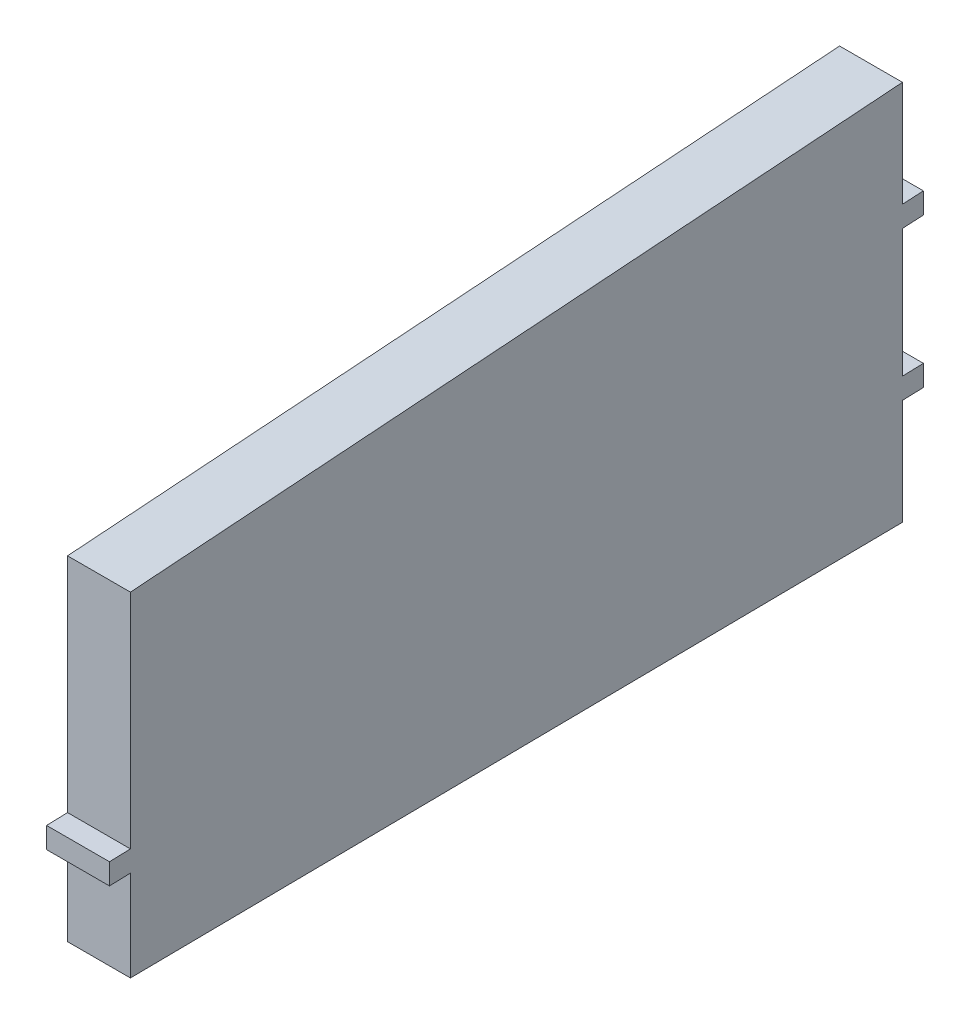
ISO-10303-21;
HEADER;
FILE_DESCRIPTION(('STEP AP214'),'2;1');
FILE_NAME('part.step','',(''),(''),'','','');
FILE_SCHEMA(('AUTOMOTIVE_DESIGN { 1 0 10303 214 1 1 1 1 }'));
ENDSEC;
DATA;
#1=APPLICATION_CONTEXT('core data for automotive mechanical design processes');
#2=APPLICATION_PROTOCOL_DEFINITION('international standard','automotive_design',2000,#1);
#3=PRODUCT_CONTEXT('',#1,'mechanical');
#4=PRODUCT('Part','Part','',(#3));
#5=PRODUCT_RELATED_PRODUCT_CATEGORY('part','',(#4));
#6=PRODUCT_DEFINITION_FORMATION('','',#4);
#7=PRODUCT_DEFINITION_CONTEXT('part definition',#1,'design');
#8=PRODUCT_DEFINITION('design','',#6,#7);
#9=PRODUCT_DEFINITION_SHAPE('','',#8);
#10=(LENGTH_UNIT() NAMED_UNIT(*) SI_UNIT(.MILLI.,.METRE.));
#11=(NAMED_UNIT(*) PLANE_ANGLE_UNIT() SI_UNIT($,.RADIAN.));
#12=(NAMED_UNIT(*) SI_UNIT($,.STERADIAN.) SOLID_ANGLE_UNIT());
#13=UNCERTAINTY_MEASURE_WITH_UNIT(LENGTH_MEASURE(1.E-05),#10,'distance_accuracy_value','');
#14=(GEOMETRIC_REPRESENTATION_CONTEXT(3) GLOBAL_UNCERTAINTY_ASSIGNED_CONTEXT((#13)) GLOBAL_UNIT_ASSIGNED_CONTEXT((#10,
#11,#12)) REPRESENTATION_CONTEXT('',''));
#15=CARTESIAN_POINT('',(0.,0.,0.));
#16=DIRECTION('',(0.,0.,1.));
#17=DIRECTION('',(1.,0.,0.));
#18=AXIS2_PLACEMENT_3D('',#15,#16,#17);
#19=CARTESIAN_POINT('',(243.017706630704,0.,0.));
#20=DIRECTION('',(-1.,0.,0.));
#21=DIRECTION('',(0.,0.,1.));
#22=AXIS2_PLACEMENT_3D('',#19,#20,#21);
#23=PLANE('',#22);
#24=DIRECTION('',(0.,1.,0.));
#25=VECTOR('',#24,1.);
#26=CARTESIAN_POINT('',(243.017706630704,403.58668461406,780.05619407791));
#27=LINE('',#26,#25);
#28=CARTESIAN_POINT('',(243.017706630704,403.58668461406,780.05619407791));
#29=VERTEX_POINT('',#28);
#30=CARTESIAN_POINT('',(243.017706630704,419.582233202834,780.05619407791));
#31=VERTEX_POINT('',#30);
#32=EDGE_CURVE('E157',#29,#31,#27,.T.);
#33=ORIENTED_EDGE('',*,*,#32,.F.);
#34=DIRECTION('',(0.,-0.0527109798388512,0.998609809988079));
#35=VECTOR('',#34,1.);
#36=CARTESIAN_POINT('',(243.017706630704,403.75427495747,776.88119407791));
#37=LINE('',#36,#35);
#38=CARTESIAN_POINT('',(243.017706630704,403.75427495747,776.88119407791));
#39=VERTEX_POINT('',#38);
#40=EDGE_CURVE('E205',#39,#29,#37,.T.);
#41=ORIENTED_EDGE('',*,*,#40,.F.);
#42=DIRECTION('',(0.,1.,0.));
#43=VECTOR('',#42,1.);
#44=CARTESIAN_POINT('',(243.017706630704,400.57927495747,776.88119407791));
#45=LINE('',#44,#43);
#46=CARTESIAN_POINT('',(243.017706630704,400.57927495747,776.88119407791));
#47=VERTEX_POINT('',#46);
#48=EDGE_CURVE('E202',#47,#39,#45,.T.);
#49=ORIENTED_EDGE('',*,*,#48,.F.);
#50=DIRECTION('',(0.,0.0527109798388512,-0.998609809988079));
#51=VECTOR('',#50,1.);
#52=CARTESIAN_POINT('',(243.017706630704,400.41168461406,780.05619407791));
#53=LINE('',#52,#51);
#54=CARTESIAN_POINT('',(243.017706630704,400.41168461406,780.05619407791));
#55=VERTEX_POINT('',#54);
#56=EDGE_CURVE('E199',#55,#47,#53,.T.);
#57=ORIENTED_EDGE('',*,*,#56,.F.);
#58=DIRECTION('',(0.,1.,0.));
#59=VECTOR('',#58,1.);
#60=CARTESIAN_POINT('',(243.017706630704,381.033509861784,780.05619407791));
#61=LINE('',#60,#59);
#62=CARTESIAN_POINT('',(243.017706630704,381.033509861784,780.05619407791));
#63=VERTEX_POINT('',#62);
#64=EDGE_CURVE('E196',#63,#55,#61,.T.);
#65=ORIENTED_EDGE('',*,*,#64,.F.);
#66=DIRECTION('',(0.,-0.0302886855912008,0.999541192510423));
#67=VECTOR('',#66,1.);
#68=CARTESIAN_POINT('',(243.017706630704,381.129720580734,776.88119407791));
#69=LINE('',#68,#67);
#70=CARTESIAN_POINT('',(243.017706630704,381.129720580734,776.88119407791));
#71=VERTEX_POINT('',#70);
#72=EDGE_CURVE('E193',#71,#63,#69,.T.);
#73=ORIENTED_EDGE('',*,*,#72,.F.);
#74=DIRECTION('',(0.,1.,0.));
#75=VECTOR('',#74,1.);
#76=CARTESIAN_POINT('',(243.017706630704,377.954720580734,776.88119407791));
#77=LINE('',#76,#75);
#78=CARTESIAN_POINT('',(243.017706630704,377.954720580734,776.88119407791));
#79=VERTEX_POINT('',#78);
#80=EDGE_CURVE('E190',#79,#71,#77,.T.);
#81=ORIENTED_EDGE('',*,*,#80,.F.);
#82=DIRECTION('',(0.,0.0302886855912008,-0.999541192510423));
#83=VECTOR('',#82,1.);
#84=CARTESIAN_POINT('',(243.017706630704,377.858509861784,780.05619407791));
#85=LINE('',#84,#83);
#86=CARTESIAN_POINT('',(243.017706630704,377.858509861784,780.05619407791));
#87=VERTEX_POINT('',#86);
#88=EDGE_CURVE('E187',#87,#79,#85,.T.);
#89=ORIENTED_EDGE('',*,*,#88,.F.);
#90=DIRECTION('',(0.,1.,0.));
#91=VECTOR('',#90,1.);
#92=CARTESIAN_POINT('',(243.017706630704,361.86296127301,780.05619407791));
#93=LINE('',#92,#91);
#94=CARTESIAN_POINT('',(243.017706630704,361.86296127301,780.05619407791));
#95=VERTEX_POINT('',#94);
#96=EDGE_CURVE('E184',#95,#87,#93,.T.);
#97=ORIENTED_EDGE('',*,*,#96,.F.);
#98=DIRECTION('',(0.,0.0111918961809718,-0.999937368768602));
#99=VECTOR('',#98,1.);
#100=CARTESIAN_POINT('',(243.017706630704,360.55403366685,897.002027495908));
#101=LINE('',#100,#99);
#102=CARTESIAN_POINT('',(243.017706630704,360.55403366685,897.002027495908));
#103=VERTEX_POINT('',#102);
#104=EDGE_CURVE('E181',#103,#95,#101,.T.);
#105=ORIENTED_EDGE('',*,*,#104,.F.);
#106=DIRECTION('',(0.,-1.,0.));
#107=VECTOR('',#106,1.);
#108=CARTESIAN_POINT('',(243.017706630704,374.314748380192,897.002027495908));
#109=LINE('',#108,#107);
#110=CARTESIAN_POINT('',(243.017706630704,374.314748380192,897.002027495908));
#111=VERTEX_POINT('',#110);
#112=EDGE_CURVE('E178',#111,#103,#109,.T.);
#113=ORIENTED_EDGE('',*,*,#112,.F.);
#114=DIRECTION('',(0.,0.0302886855911833,-0.999541192510423));
#115=VECTOR('',#114,1.);
#116=CARTESIAN_POINT('',(243.017706630704,374.218537661241,900.177027495908));
#117=LINE('',#116,#115);
#118=CARTESIAN_POINT('',(243.017706630704,374.218537661241,900.177027495908));
#119=VERTEX_POINT('',#118);
#120=EDGE_CURVE('E175',#119,#111,#117,.T.);
#121=ORIENTED_EDGE('',*,*,#120,.F.);
#122=DIRECTION('',(0.,-1.,0.));
#123=VECTOR('',#122,1.);
#124=CARTESIAN_POINT('',(243.017706630704,377.393537661241,900.177027495908));
#125=LINE('',#124,#123);
#126=CARTESIAN_POINT('',(243.017706630704,377.393537661241,900.177027495908));
#127=VERTEX_POINT('',#126);
#128=EDGE_CURVE('E172',#127,#119,#125,.T.);
#129=ORIENTED_EDGE('',*,*,#128,.F.);
#130=DIRECTION('',(0.,-0.0302886855912008,0.999541192510423));
#131=VECTOR('',#130,1.);
#132=CARTESIAN_POINT('',(243.017706630704,377.489748380192,897.002027495908));
#133=LINE('',#132,#131);
#134=CARTESIAN_POINT('',(243.017706630704,377.489748380192,897.002027495908));
#135=VERTEX_POINT('',#134);
#136=EDGE_CURVE('E169',#135,#127,#133,.T.);
#137=ORIENTED_EDGE('',*,*,#136,.F.);
#138=DIRECTION('',(0.,-1.,0.));
#139=VECTOR('',#138,1.);
#140=CARTESIAN_POINT('',(243.017706630704,394.238773631358,897.002027495908));
#141=LINE('',#140,#139);
#142=CARTESIAN_POINT('',(243.017706630704,411.174488344699,897.002027495908));
#143=VERTEX_POINT('',#142);
#144=EDGE_CURVE('E160',#143,#135,#141,.T.);
#145=ORIENTED_EDGE('',*,*,#144,.F.);
#146=DIRECTION('',(0.,-0.0717092650488425,0.997425576825737));
#147=VECTOR('',#146,1.);
#148=CARTESIAN_POINT('',(243.017706630704,419.582233202834,780.05619407791));
#149=LINE('',#148,#147);
#150=EDGE_CURVE('E149',#31,#143,#149,.T.);
#151=ORIENTED_EDGE('',*,*,#150,.F.);
#152=EDGE_LOOP('',(#33,#41,#49,#57,#65,#73,#81,#89,#97,#105,#113,#121,#129,#137,#145,#151));
#153=FACE_BOUND('',#152,.T.);
#154=ADVANCED_FACE('F33',(#153),#23,.T.);
#155=CARTESIAN_POINT('',(389.24014946962,403.75427495747,776.88119407791));
#156=DIRECTION('',(0.,-0.998609809988079,-0.0527109798388512));
#157=DIRECTION('',(0.,0.0527109798388512,-0.99860980998808));
#158=AXIS2_PLACEMENT_3D('',#155,#156,#157);
#159=PLANE('',#158);
#160=DIRECTION('',(-1.,0.,0.));
#161=VECTOR('',#160,1.);
#162=CARTESIAN_POINT('',(389.24014946962,403.58668461406,780.05619407791));
#163=LINE('',#162,#161);
#164=CARTESIAN_POINT('',(252.542706630704,403.58668461406,780.05619407791));
#165=VERTEX_POINT('',#164);
#166=EDGE_CURVE('E163',#165,#29,#163,.T.);
#167=ORIENTED_EDGE('',*,*,#166,.F.);
#168=DIRECTION('',(0.,0.0527109798388512,-0.99860980998808));
#169=VECTOR('',#168,1.);
#170=CARTESIAN_POINT('',(252.542706630704,403.75427495747,776.88119407791));
#171=LINE('',#170,#169);
#172=CARTESIAN_POINT('',(252.542706630704,403.75427495747,776.88119407791));
#173=VERTEX_POINT('',#172);
#174=EDGE_CURVE('E37',#165,#173,#171,.T.);
#175=ORIENTED_EDGE('',*,*,#174,.T.);
#176=DIRECTION('',(-1.,0.,0.));
#177=VECTOR('',#176,1.);
#178=CARTESIAN_POINT('',(389.24014946962,403.75427495747,776.88119407791));
#179=LINE('',#178,#177);
#180=EDGE_CURVE('E208',#173,#39,#179,.T.);
#181=ORIENTED_EDGE('',*,*,#180,.T.);
#182=ORIENTED_EDGE('',*,*,#40,.T.);
#183=EDGE_LOOP('',(#167,#175,#181,#182));
#184=FACE_BOUND('',#183,.T.);
#185=ADVANCED_FACE('F277',(#184),#159,.F.);
#186=CARTESIAN_POINT('',(389.24014946962,400.57927495747,776.88119407791));
#187=DIRECTION('',(0.,0.,1.));
#188=DIRECTION('',(1.,0.,0.));
#189=AXIS2_PLACEMENT_3D('',#186,#187,#188);
#190=PLANE('',#189);
#191=ORIENTED_EDGE('',*,*,#180,.F.);
#192=DIRECTION('',(0.,-1.,0.));
#193=VECTOR('',#192,1.);
#194=CARTESIAN_POINT('',(252.542706630704,400.57927495747,776.88119407791));
#195=LINE('',#194,#193);
#196=CARTESIAN_POINT('',(252.542706630704,400.57927495747,776.88119407791));
#197=VERTEX_POINT('',#196);
#198=EDGE_CURVE('E271',#173,#197,#195,.T.);
#199=ORIENTED_EDGE('',*,*,#198,.T.);
#200=DIRECTION('',(-1.,0.,0.));
#201=VECTOR('',#200,1.);
#202=CARTESIAN_POINT('',(389.24014946962,400.57927495747,776.88119407791));
#203=LINE('',#202,#201);
#204=EDGE_CURVE('E210',#197,#47,#203,.T.);
#205=ORIENTED_EDGE('',*,*,#204,.T.);
#206=ORIENTED_EDGE('',*,*,#48,.T.);
#207=EDGE_LOOP('',(#191,#199,#205,#206));
#208=FACE_BOUND('',#207,.T.);
#209=ADVANCED_FACE('F280',(#208),#190,.F.);
#210=CARTESIAN_POINT('',(389.24014946962,400.41168461406,780.05619407791));
#211=DIRECTION('',(0.,0.998609809988079,0.0527109798388512));
#212=DIRECTION('',(0.,-0.0527109798388512,0.99860980998808));
#213=AXIS2_PLACEMENT_3D('',#210,#211,#212);
#214=PLANE('',#213);
#215=ORIENTED_EDGE('',*,*,#204,.F.);
#216=DIRECTION('',(0.,-0.0527109798388512,0.99860980998808));
#217=VECTOR('',#216,1.);
#218=CARTESIAN_POINT('',(252.542706630704,400.41168461406,780.05619407791));
#219=LINE('',#218,#217);
#220=CARTESIAN_POINT('',(252.542706630704,400.41168461406,780.05619407791));
#221=VERTEX_POINT('',#220);
#222=EDGE_CURVE('E268',#197,#221,#219,.T.);
#223=ORIENTED_EDGE('',*,*,#222,.T.);
#224=DIRECTION('',(-1.,0.,0.));
#225=VECTOR('',#224,1.);
#226=CARTESIAN_POINT('',(389.24014946962,400.41168461406,780.05619407791));
#227=LINE('',#226,#225);
#228=EDGE_CURVE('E212',#221,#55,#227,.T.);
#229=ORIENTED_EDGE('',*,*,#228,.T.);
#230=ORIENTED_EDGE('',*,*,#56,.T.);
#231=EDGE_LOOP('',(#215,#223,#229,#230));
#232=FACE_BOUND('',#231,.T.);
#233=ADVANCED_FACE('F286',(#232),#214,.F.);
#234=CARTESIAN_POINT('',(389.24014946962,381.033509861784,780.05619407791));
#235=DIRECTION('',(0.,0.,1.));
#236=DIRECTION('',(0.,-1.,0.));
#237=AXIS2_PLACEMENT_3D('',#234,#235,#236);
#238=PLANE('',#237);
#239=ORIENTED_EDGE('',*,*,#228,.F.);
#240=DIRECTION('',(0.,-1.,0.));
#241=VECTOR('',#240,1.);
#242=CARTESIAN_POINT('',(252.542706630704,381.033509861784,780.05619407791));
#243=LINE('',#242,#241);
#244=CARTESIAN_POINT('',(252.542706630704,381.033509861784,780.05619407791));
#245=VERTEX_POINT('',#244);
#246=EDGE_CURVE('E265',#221,#245,#243,.T.);
#247=ORIENTED_EDGE('',*,*,#246,.T.);
#248=DIRECTION('',(-1.,0.,0.));
#249=VECTOR('',#248,1.);
#250=CARTESIAN_POINT('',(389.24014946962,381.033509861784,780.05619407791));
#251=LINE('',#250,#249);
#252=EDGE_CURVE('E214',#245,#63,#251,.T.);
#253=ORIENTED_EDGE('',*,*,#252,.T.);
#254=ORIENTED_EDGE('',*,*,#64,.T.);
#255=EDGE_LOOP('',(#239,#247,#253,#254));
#256=FACE_BOUND('',#255,.T.);
#257=ADVANCED_FACE('F289',(#256),#238,.F.);
#258=CARTESIAN_POINT('',(389.24014946962,381.129720580734,776.88119407791));
#259=DIRECTION('',(0.,-0.999541192510423,-0.0302886855912008));
#260=DIRECTION('',(0.,0.0302886855912008,-0.999541192510423));
#261=AXIS2_PLACEMENT_3D('',#258,#259,#260);
#262=PLANE('',#261);
#263=ORIENTED_EDGE('',*,*,#252,.F.);
#264=DIRECTION('',(0.,0.0302886855912008,-0.999541192510423));
#265=VECTOR('',#264,1.);
#266=CARTESIAN_POINT('',(252.542706630704,381.129720580734,776.88119407791));
#267=LINE('',#266,#265);
#268=CARTESIAN_POINT('',(252.542706630704,381.129720580734,776.88119407791));
#269=VERTEX_POINT('',#268);
#270=EDGE_CURVE('E262',#245,#269,#267,.T.);
#271=ORIENTED_EDGE('',*,*,#270,.T.);
#272=DIRECTION('',(-1.,0.,0.));
#273=VECTOR('',#272,1.);
#274=CARTESIAN_POINT('',(389.24014946962,381.129720580734,776.88119407791));
#275=LINE('',#274,#273);
#276=EDGE_CURVE('E216',#269,#71,#275,.T.);
#277=ORIENTED_EDGE('',*,*,#276,.T.);
#278=ORIENTED_EDGE('',*,*,#72,.T.);
#279=EDGE_LOOP('',(#263,#271,#277,#278));
#280=FACE_BOUND('',#279,.T.);
#281=ADVANCED_FACE('F292',(#280),#262,.F.);
#282=CARTESIAN_POINT('',(389.24014946962,377.954720580734,776.88119407791));
#283=DIRECTION('',(0.,0.,1.));
#284=DIRECTION('',(1.,0.,0.));
#285=AXIS2_PLACEMENT_3D('',#282,#283,#284);
#286=PLANE('',#285);
#287=ORIENTED_EDGE('',*,*,#276,.F.);
#288=DIRECTION('',(0.,-1.,0.));
#289=VECTOR('',#288,1.);
#290=CARTESIAN_POINT('',(252.542706630704,377.954720580734,776.88119407791));
#291=LINE('',#290,#289);
#292=CARTESIAN_POINT('',(252.542706630704,377.954720580734,776.88119407791));
#293=VERTEX_POINT('',#292);
#294=EDGE_CURVE('E259',#269,#293,#291,.T.);
#295=ORIENTED_EDGE('',*,*,#294,.T.);
#296=DIRECTION('',(-1.,0.,0.));
#297=VECTOR('',#296,1.);
#298=CARTESIAN_POINT('',(389.24014946962,377.954720580734,776.88119407791));
#299=LINE('',#298,#297);
#300=EDGE_CURVE('E218',#293,#79,#299,.T.);
#301=ORIENTED_EDGE('',*,*,#300,.T.);
#302=ORIENTED_EDGE('',*,*,#80,.T.);
#303=EDGE_LOOP('',(#287,#295,#301,#302));
#304=FACE_BOUND('',#303,.T.);
#305=ADVANCED_FACE('F298',(#304),#286,.F.);
#306=CARTESIAN_POINT('',(389.24014946962,377.858509861784,780.05619407791));
#307=DIRECTION('',(0.,0.999541192510423,0.0302886855912008));
#308=DIRECTION('',(0.,-0.0302886855912008,0.999541192510423));
#309=AXIS2_PLACEMENT_3D('',#306,#307,#308);
#310=PLANE('',#309);
#311=ORIENTED_EDGE('',*,*,#300,.F.);
#312=DIRECTION('',(0.,-0.0302886855912008,0.999541192510423));
#313=VECTOR('',#312,1.);
#314=CARTESIAN_POINT('',(252.542706630704,377.858509861784,780.05619407791));
#315=LINE('',#314,#313);
#316=CARTESIAN_POINT('',(252.542706630704,377.858509861784,780.05619407791));
#317=VERTEX_POINT('',#316);
#318=EDGE_CURVE('E256',#293,#317,#315,.T.);
#319=ORIENTED_EDGE('',*,*,#318,.T.);
#320=DIRECTION('',(-1.,0.,0.));
#321=VECTOR('',#320,1.);
#322=CARTESIAN_POINT('',(389.24014946962,377.858509861784,780.05619407791));
#323=LINE('',#322,#321);
#324=EDGE_CURVE('E220',#317,#87,#323,.T.);
#325=ORIENTED_EDGE('',*,*,#324,.T.);
#326=ORIENTED_EDGE('',*,*,#88,.T.);
#327=EDGE_LOOP('',(#311,#319,#325,#326));
#328=FACE_BOUND('',#327,.T.);
#329=ADVANCED_FACE('F301',(#328),#310,.F.);
#330=CARTESIAN_POINT('',(389.24014946962,361.86296127301,780.05619407791));
#331=DIRECTION('',(0.,0.,1.));
#332=DIRECTION('',(0.,-1.,0.));
#333=AXIS2_PLACEMENT_3D('',#330,#331,#332);
#334=PLANE('',#333);
#335=ORIENTED_EDGE('',*,*,#324,.F.);
#336=DIRECTION('',(0.,-1.,0.));
#337=VECTOR('',#336,1.);
#338=CARTESIAN_POINT('',(252.542706630704,361.86296127301,780.05619407791));
#339=LINE('',#338,#337);
#340=CARTESIAN_POINT('',(252.542706630704,361.86296127301,780.05619407791));
#341=VERTEX_POINT('',#340);
#342=EDGE_CURVE('E253',#317,#341,#339,.T.);
#343=ORIENTED_EDGE('',*,*,#342,.T.);
#344=DIRECTION('',(-1.,0.,0.));
#345=VECTOR('',#344,1.);
#346=CARTESIAN_POINT('',(389.24014946962,361.86296127301,780.05619407791));
#347=LINE('',#346,#345);
#348=EDGE_CURVE('E222',#341,#95,#347,.T.);
#349=ORIENTED_EDGE('',*,*,#348,.T.);
#350=ORIENTED_EDGE('',*,*,#96,.T.);
#351=EDGE_LOOP('',(#335,#343,#349,#350));
#352=FACE_BOUND('',#351,.T.);
#353=ADVANCED_FACE('F304',(#352),#334,.F.);
#354=CARTESIAN_POINT('',(389.24014946962,360.55403366685,897.002027495908));
#355=DIRECTION('',(0.,0.999937368768602,0.0111918961809718));
#356=DIRECTION('',(0.,-0.0111918961809718,0.999937368768602));
#357=AXIS2_PLACEMENT_3D('',#354,#355,#356);
#358=PLANE('',#357);
#359=ORIENTED_EDGE('',*,*,#348,.F.);
#360=DIRECTION('',(0.,-0.0111918961809718,0.999937368768602));
#361=VECTOR('',#360,1.);
#362=CARTESIAN_POINT('',(252.542706630704,360.55403366685,897.002027495908));
#363=LINE('',#362,#361);
#364=CARTESIAN_POINT('',(252.542706630704,360.55403366685,897.002027495908));
#365=VERTEX_POINT('',#364);
#366=EDGE_CURVE('E250',#341,#365,#363,.T.);
#367=ORIENTED_EDGE('',*,*,#366,.T.);
#368=DIRECTION('',(-1.,0.,0.));
#369=VECTOR('',#368,1.);
#370=CARTESIAN_POINT('',(389.24014946962,360.55403366685,897.002027495908));
#371=LINE('',#370,#369);
#372=EDGE_CURVE('E224',#365,#103,#371,.T.);
#373=ORIENTED_EDGE('',*,*,#372,.T.);
#374=ORIENTED_EDGE('',*,*,#104,.T.);
#375=EDGE_LOOP('',(#359,#367,#373,#374));
#376=FACE_BOUND('',#375,.T.);
#377=ADVANCED_FACE('F310',(#376),#358,.F.);
#378=CARTESIAN_POINT('',(389.24014946962,374.314748380192,897.002027495908));
#379=DIRECTION('',(0.,0.,-1.));
#380=DIRECTION('',(-1.,0.,0.));
#381=AXIS2_PLACEMENT_3D('',#378,#379,#380);
#382=PLANE('',#381);
#383=ORIENTED_EDGE('',*,*,#372,.F.);
#384=DIRECTION('',(0.,1.,0.));
#385=VECTOR('',#384,1.);
#386=CARTESIAN_POINT('',(252.542706630704,374.314748380192,897.002027495908));
#387=LINE('',#386,#385);
#388=CARTESIAN_POINT('',(252.542706630704,374.314748380192,897.002027495908));
#389=VERTEX_POINT('',#388);
#390=EDGE_CURVE('E247',#365,#389,#387,.T.);
#391=ORIENTED_EDGE('',*,*,#390,.T.);
#392=DIRECTION('',(-1.,0.,0.));
#393=VECTOR('',#392,1.);
#394=CARTESIAN_POINT('',(389.24014946962,374.314748380192,897.002027495908));
#395=LINE('',#394,#393);
#396=EDGE_CURVE('E226',#389,#111,#395,.T.);
#397=ORIENTED_EDGE('',*,*,#396,.T.);
#398=ORIENTED_EDGE('',*,*,#112,.T.);
#399=EDGE_LOOP('',(#383,#391,#397,#398));
#400=FACE_BOUND('',#399,.T.);
#401=ADVANCED_FACE('F313',(#400),#382,.F.);
#402=CARTESIAN_POINT('',(389.24014946962,374.218537661241,900.177027495908));
#403=DIRECTION('',(0.,0.999541192510423,0.0302886855911833));
#404=DIRECTION('',(0.,-0.0302886855911833,0.999541192510423));
#405=AXIS2_PLACEMENT_3D('',#402,#403,#404);
#406=PLANE('',#405);
#407=ORIENTED_EDGE('',*,*,#396,.F.);
#408=DIRECTION('',(0.,-0.0302886855911833,0.999541192510423));
#409=VECTOR('',#408,1.);
#410=CARTESIAN_POINT('',(252.542706630704,374.218537661241,900.177027495908));
#411=LINE('',#410,#409);
#412=CARTESIAN_POINT('',(252.542706630704,374.218537661241,900.177027495908));
#413=VERTEX_POINT('',#412);
#414=EDGE_CURVE('E244',#389,#413,#411,.T.);
#415=ORIENTED_EDGE('',*,*,#414,.T.);
#416=DIRECTION('',(-1.,0.,0.));
#417=VECTOR('',#416,1.);
#418=CARTESIAN_POINT('',(389.24014946962,374.218537661241,900.177027495908));
#419=LINE('',#418,#417);
#420=EDGE_CURVE('E228',#413,#119,#419,.T.);
#421=ORIENTED_EDGE('',*,*,#420,.T.);
#422=ORIENTED_EDGE('',*,*,#120,.T.);
#423=EDGE_LOOP('',(#407,#415,#421,#422));
#424=FACE_BOUND('',#423,.T.);
#425=ADVANCED_FACE('F316',(#424),#406,.F.);
#426=CARTESIAN_POINT('',(389.24014946962,377.393537661241,900.177027495908));
#427=DIRECTION('',(0.,0.,-1.));
#428=DIRECTION('',(-1.,0.,0.));
#429=AXIS2_PLACEMENT_3D('',#426,#427,#428);
#430=PLANE('',#429);
#431=ORIENTED_EDGE('',*,*,#420,.F.);
#432=DIRECTION('',(0.,1.,0.));
#433=VECTOR('',#432,1.);
#434=CARTESIAN_POINT('',(252.542706630704,377.393537661241,900.177027495908));
#435=LINE('',#434,#433);
#436=CARTESIAN_POINT('',(252.542706630704,377.393537661241,900.177027495908));
#437=VERTEX_POINT('',#436);
#438=EDGE_CURVE('E239',#413,#437,#435,.T.);
#439=ORIENTED_EDGE('',*,*,#438,.T.);
#440=DIRECTION('',(-1.,0.,0.));
#441=VECTOR('',#440,1.);
#442=CARTESIAN_POINT('',(389.24014946962,377.393537661241,900.177027495908));
#443=LINE('',#442,#441);
#444=EDGE_CURVE('E230',#437,#127,#443,.T.);
#445=ORIENTED_EDGE('',*,*,#444,.T.);
#446=ORIENTED_EDGE('',*,*,#128,.T.);
#447=EDGE_LOOP('',(#431,#439,#445,#446));
#448=FACE_BOUND('',#447,.T.);
#449=ADVANCED_FACE('F320',(#448),#430,.F.);
#450=CARTESIAN_POINT('',(389.24014946962,377.489748380192,897.002027495908));
#451=DIRECTION('',(0.,-0.999541192510423,-0.0302886855912008));
#452=DIRECTION('',(0.,0.0302886855912008,-0.999541192510423));
#453=AXIS2_PLACEMENT_3D('',#450,#451,#452);
#454=PLANE('',#453);
#455=ORIENTED_EDGE('',*,*,#444,.F.);
#456=DIRECTION('',(0.,0.0302886855912008,-0.999541192510423));
#457=VECTOR('',#456,1.);
#458=CARTESIAN_POINT('',(252.542706630704,377.489748380192,897.002027495908));
#459=LINE('',#458,#457);
#460=CARTESIAN_POINT('',(252.542706630704,377.489748380192,897.002027495908));
#461=VERTEX_POINT('',#460);
#462=EDGE_CURVE('E237',#437,#461,#459,.T.);
#463=ORIENTED_EDGE('',*,*,#462,.T.);
#464=DIRECTION('',(-1.,0.,0.));
#465=VECTOR('',#464,1.);
#466=CARTESIAN_POINT('',(389.24014946962,377.489748380192,897.002027495908));
#467=LINE('',#466,#465);
#468=EDGE_CURVE('E232',#461,#135,#467,.T.);
#469=ORIENTED_EDGE('',*,*,#468,.T.);
#470=ORIENTED_EDGE('',*,*,#136,.T.);
#471=EDGE_LOOP('',(#455,#463,#469,#470));
#472=FACE_BOUND('',#471,.T.);
#473=ADVANCED_FACE('F323',(#472),#454,.F.);
#474=CARTESIAN_POINT('',(389.24014946962,394.238773631358,897.002027495908));
#475=DIRECTION('',(0.,0.,-1.));
#476=DIRECTION('',(-1.,0.,0.));
#477=AXIS2_PLACEMENT_3D('',#474,#475,#476);
#478=PLANE('',#477);
#479=ORIENTED_EDGE('',*,*,#468,.F.);
#480=DIRECTION('',(0.,1.,0.));
#481=VECTOR('',#480,1.);
#482=CARTESIAN_POINT('',(252.542706630704,394.238773631358,897.002027495908));
#483=LINE('',#482,#481);
#484=CARTESIAN_POINT('',(252.542706630704,411.174488344699,897.002027495908));
#485=VERTEX_POINT('',#484);
#486=EDGE_CURVE('E54',#461,#485,#483,.T.);
#487=ORIENTED_EDGE('',*,*,#486,.T.);
#488=DIRECTION('',(-1.,0.,0.));
#489=VECTOR('',#488,1.);
#490=CARTESIAN_POINT('',(389.24014946962,411.174488344699,897.002027495908));
#491=LINE('',#490,#489);
#492=EDGE_CURVE('E152',#485,#143,#491,.T.);
#493=ORIENTED_EDGE('',*,*,#492,.T.);
#494=ORIENTED_EDGE('',*,*,#144,.T.);
#495=EDGE_LOOP('',(#479,#487,#493,#494));
#496=FACE_BOUND('',#495,.T.);
#497=ADVANCED_FACE('F235',(#496),#478,.F.);
#498=CARTESIAN_POINT('',(389.24014946962,419.582233202834,780.05619407791));
#499=DIRECTION('',(0.,-0.997425576825737,-0.0717092650488425));
#500=DIRECTION('',(0.,0.0717092650488425,-0.997425576825738));
#501=AXIS2_PLACEMENT_3D('',#498,#499,#500);
#502=PLANE('',#501);
#503=ORIENTED_EDGE('',*,*,#492,.F.);
#504=DIRECTION('',(0.,0.0717092650488425,-0.997425576825737));
#505=VECTOR('',#504,1.);
#506=CARTESIAN_POINT('',(252.542706630704,419.582233202834,780.05619407791));
#507=LINE('',#506,#505);
#508=CARTESIAN_POINT('',(252.542706630704,419.582233202834,780.05619407791));
#509=VERTEX_POINT('',#508);
#510=EDGE_CURVE('E42',#485,#509,#507,.T.);
#511=ORIENTED_EDGE('',*,*,#510,.T.);
#512=DIRECTION('',(-1.,0.,0.));
#513=VECTOR('',#512,1.);
#514=CARTESIAN_POINT('',(389.24014946962,419.582233202834,780.05619407791));
#515=LINE('',#514,#513);
#516=EDGE_CURVE('E146',#509,#31,#515,.T.);
#517=ORIENTED_EDGE('',*,*,#516,.T.);
#518=ORIENTED_EDGE('',*,*,#150,.T.);
#519=EDGE_LOOP('',(#503,#511,#517,#518));
#520=FACE_BOUND('',#519,.T.);
#521=ADVANCED_FACE('F148',(#520),#502,.F.);
#522=CARTESIAN_POINT('',(389.24014946962,403.58668461406,780.05619407791));
#523=DIRECTION('',(0.,0.,1.));
#524=DIRECTION('',(1.,0.,0.));
#525=AXIS2_PLACEMENT_3D('',#522,#523,#524);
#526=PLANE('',#525);
#527=ORIENTED_EDGE('',*,*,#516,.F.);
#528=DIRECTION('',(0.,-1.,0.));
#529=VECTOR('',#528,1.);
#530=CARTESIAN_POINT('',(252.542706630704,403.58668461406,780.05619407791));
#531=LINE('',#530,#529);
#532=EDGE_CURVE('E11',#509,#165,#531,.T.);
#533=ORIENTED_EDGE('',*,*,#532,.T.);
#534=ORIENTED_EDGE('',*,*,#166,.T.);
#535=ORIENTED_EDGE('',*,*,#32,.T.);
#536=EDGE_LOOP('',(#527,#533,#534,#535));
#537=FACE_BOUND('',#536,.T.);
#538=ADVANCED_FACE('F35',(#537),#526,.F.);
#539=CARTESIAN_POINT('',(252.542706630704,344.834338896103,776.88119407791));
#540=DIRECTION('',(-1.,0.,0.));
#541=DIRECTION('',(0.,0.,1.));
#542=AXIS2_PLACEMENT_3D('',#539,#540,#541);
#543=PLANE('',#542);
#544=ORIENTED_EDGE('',*,*,#510,.F.);
#545=ORIENTED_EDGE('',*,*,#486,.F.);
#546=ORIENTED_EDGE('',*,*,#462,.F.);
#547=ORIENTED_EDGE('',*,*,#438,.F.);
#548=ORIENTED_EDGE('',*,*,#414,.F.);
#549=ORIENTED_EDGE('',*,*,#390,.F.);
#550=ORIENTED_EDGE('',*,*,#366,.F.);
#551=ORIENTED_EDGE('',*,*,#342,.F.);
#552=ORIENTED_EDGE('',*,*,#318,.F.);
#553=ORIENTED_EDGE('',*,*,#294,.F.);
#554=ORIENTED_EDGE('',*,*,#270,.F.);
#555=ORIENTED_EDGE('',*,*,#246,.F.);
#556=ORIENTED_EDGE('',*,*,#222,.F.);
#557=ORIENTED_EDGE('',*,*,#198,.F.);
#558=ORIENTED_EDGE('',*,*,#174,.F.);
#559=ORIENTED_EDGE('',*,*,#532,.F.);
#560=EDGE_LOOP('',(#544,#545,#546,#547,#548,#549,#550,#551,#552,#553,#554,#555,#556,#557,#558,#559));
#561=FACE_BOUND('',#560,.T.);
#562=ADVANCED_FACE('F278',(#561),#543,.F.);
#563=CLOSED_SHELL('',(#154,#185,#209,#233,#257,#281,#305,#329,#353,#377,#401,#425,#449,#473,
#497,#521,#538,#562));
#564=MANIFOLD_SOLID_BREP('B2',#563);
#565=ADVANCED_BREP_SHAPE_REPRESENTATION('',(#18,#564),#14);
#566=SHAPE_DEFINITION_REPRESENTATION(#9,#565);
ENDSEC;
END-ISO-10303-21;
